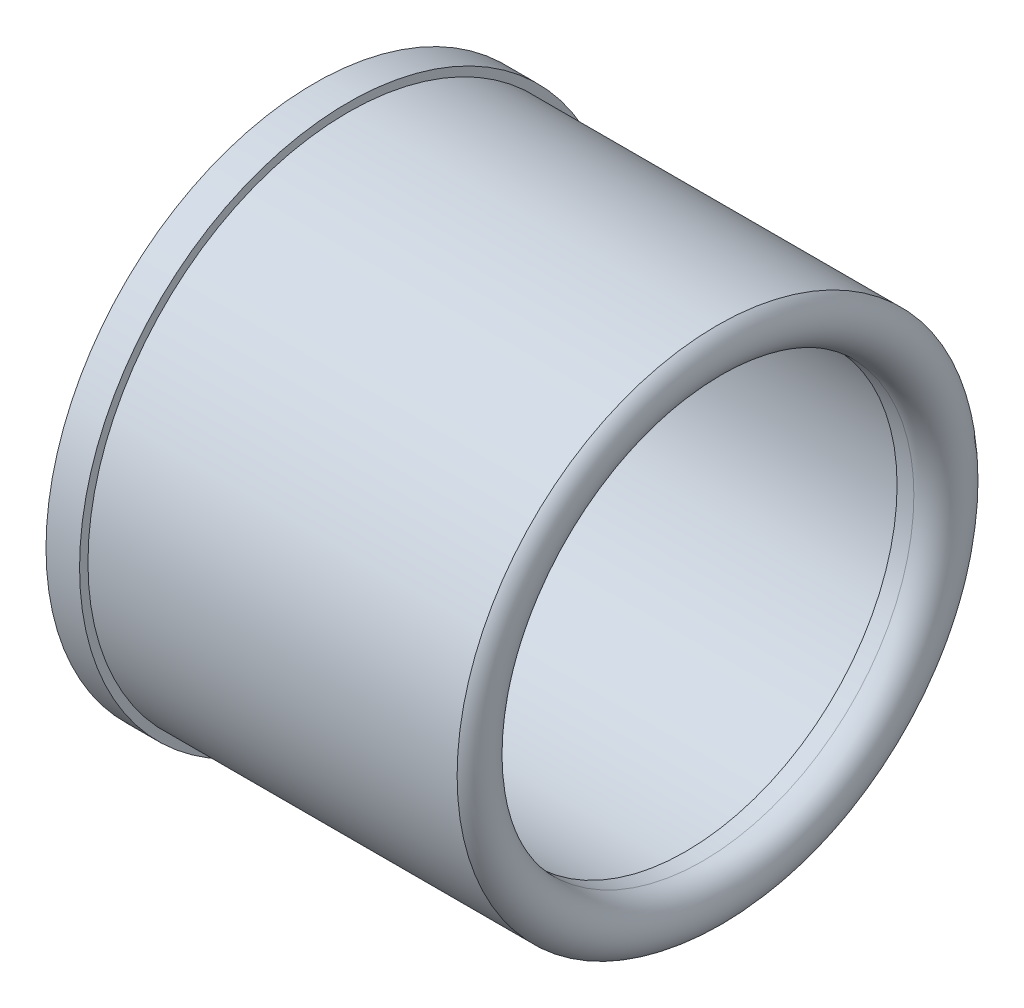
ISO-10303-21;
HEADER;
FILE_DESCRIPTION(('STEP AP214'),'2;1');
FILE_NAME('part.step','',(''),(''),'','','');
FILE_SCHEMA(('AUTOMOTIVE_DESIGN { 1 0 10303 214 1 1 1 1 }'));
ENDSEC;
DATA;
#1=APPLICATION_CONTEXT('core data for automotive mechanical design processes');
#2=APPLICATION_PROTOCOL_DEFINITION('international standard','automotive_design',2000,#1);
#3=PRODUCT_CONTEXT('',#1,'mechanical');
#4=PRODUCT('Part','Part','',(#3));
#5=PRODUCT_RELATED_PRODUCT_CATEGORY('part','',(#4));
#6=PRODUCT_DEFINITION_FORMATION('','',#4);
#7=PRODUCT_DEFINITION_CONTEXT('part definition',#1,'design');
#8=PRODUCT_DEFINITION('design','',#6,#7);
#9=PRODUCT_DEFINITION_SHAPE('','',#8);
#10=(LENGTH_UNIT() NAMED_UNIT(*) SI_UNIT(.MILLI.,.METRE.));
#11=(NAMED_UNIT(*) PLANE_ANGLE_UNIT() SI_UNIT($,.RADIAN.));
#12=(NAMED_UNIT(*) SI_UNIT($,.STERADIAN.) SOLID_ANGLE_UNIT());
#13=UNCERTAINTY_MEASURE_WITH_UNIT(LENGTH_MEASURE(1.E-05),#10,'distance_accuracy_value','');
#14=(GEOMETRIC_REPRESENTATION_CONTEXT(3) GLOBAL_UNCERTAINTY_ASSIGNED_CONTEXT((#13)) GLOBAL_UNIT_ASSIGNED_CONTEXT((#10,
#11,#12)) REPRESENTATION_CONTEXT('',''));
#15=CARTESIAN_POINT('',(0.,0.,0.));
#16=DIRECTION('',(0.,0.,1.));
#17=DIRECTION('',(1.,0.,0.));
#18=AXIS2_PLACEMENT_3D('',#15,#16,#17);
#19=CARTESIAN_POINT('',(12.1757416936097,-8.53326323507829,0.));
#20=DIRECTION('',(-1.,0.,0.));
#21=DIRECTION('',(0.,0.,1.));
#22=AXIS2_PLACEMENT_3D('',#19,#20,#21);
#23=CYLINDRICAL_SURFACE('',#22,6.3);
#24=CARTESIAN_POINT('',(11.9728126653829,-8.53326323507829,0.));
#25=DIRECTION('',(-1.,0.,0.));
#26=DIRECTION('',(0.,0.,1.));
#27=AXIS2_PLACEMENT_3D('',#24,#25,#26);
#28=CIRCLE('',#27,6.3);
#29=CARTESIAN_POINT('',(11.9728126653829,-8.53326323507829,6.3));
#30=VERTEX_POINT('',#29);
#31=EDGE_CURVE('E10',#30,#30,#28,.T.);
#32=ORIENTED_EDGE('',*,*,#31,.T.);
#33=EDGE_LOOP('',(#32));
#34=FACE_BOUND('',#33,.T.);
#35=CARTESIAN_POINT('',(12.4728126653829,-8.53326323507829,0.));
#36=DIRECTION('',(-1.,0.,0.));
#37=DIRECTION('',(0.,0.,1.));
#38=AXIS2_PLACEMENT_3D('',#35,#36,#37);
#39=CIRCLE('',#38,6.3);
#40=CARTESIAN_POINT('',(12.4728126653829,-8.53326323507829,6.3));
#41=VERTEX_POINT('',#40);
#42=EDGE_CURVE('E61',#41,#41,#39,.T.);
#43=ORIENTED_EDGE('',*,*,#42,.F.);
#44=EDGE_LOOP('',(#43));
#45=FACE_BOUND('',#44,.T.);
#46=ADVANCED_FACE('F33',(#34,#45),#23,.F.);
#47=CARTESIAN_POINT('',(11.9728126653829,-2.23326323507829,0.));
#48=DIRECTION('',(-1.,0.,0.));
#49=DIRECTION('',(0.,0.,1.));
#50=AXIS2_PLACEMENT_3D('',#47,#48,#49);
#51=PLANE('',#50);
#52=CARTESIAN_POINT('',(11.9728126653829,-8.53326323507829,0.));
#53=DIRECTION('',(-1.,0.,0.));
#54=DIRECTION('',(0.,0.,1.));
#55=AXIS2_PLACEMENT_3D('',#52,#53,#54);
#56=CIRCLE('',#55,6.55);
#57=CARTESIAN_POINT('',(11.9728126653829,-8.53326323507829,6.55));
#58=VERTEX_POINT('',#57);
#59=EDGE_CURVE('E39',#58,#58,#56,.T.);
#60=ORIENTED_EDGE('',*,*,#59,.T.);
#61=EDGE_LOOP('',(#60));
#62=FACE_BOUND('',#61,.T.);
#63=ORIENTED_EDGE('',*,*,#31,.F.);
#64=EDGE_LOOP('',(#63));
#65=FACE_BOUND('',#64,.T.);
#66=ADVANCED_FACE('F69',(#62,#65),#51,.T.);
#67=CARTESIAN_POINT('',(12.1757416936097,-8.53326323507829,0.));
#68=DIRECTION('',(-1.,0.,0.));
#69=DIRECTION('',(0.,0.,1.));
#70=AXIS2_PLACEMENT_3D('',#67,#68,#69);
#71=CYLINDRICAL_SURFACE('',#70,6.55);
#72=CARTESIAN_POINT('',(0.912123334161097,-8.53326323507829,0.));
#73=DIRECTION('',(-1.,0.,0.));
#74=DIRECTION('',(0.,0.,1.));
#75=AXIS2_PLACEMENT_3D('',#72,#73,#74);
#76=CIRCLE('',#75,6.55);
#77=CARTESIAN_POINT('',(0.912123334161097,-8.53326323507829,6.55));
#78=VERTEX_POINT('',#77);
#79=EDGE_CURVE('E43',#78,#78,#76,.T.);
#80=ORIENTED_EDGE('',*,*,#79,.T.);
#81=EDGE_LOOP('',(#80));
#82=FACE_BOUND('',#81,.T.);
#83=ORIENTED_EDGE('',*,*,#59,.F.);
#84=EDGE_LOOP('',(#83));
#85=FACE_BOUND('',#84,.T.);
#86=ADVANCED_FACE('F73',(#82,#85),#71,.F.);
#87=CARTESIAN_POINT('',(0.912123334161096,-1.98326323507829,0.));
#88=DIRECTION('',(-1.,0.,0.));
#89=DIRECTION('',(0.,0.,1.));
#90=AXIS2_PLACEMENT_3D('',#87,#88,#89);
#91=PLANE('',#90);
#92=CARTESIAN_POINT('',(0.912123334161097,-8.53326323507829,0.));
#93=DIRECTION('',(-1.,0.,0.));
#94=DIRECTION('',(0.,0.,1.));
#95=AXIS2_PLACEMENT_3D('',#92,#93,#94);
#96=CIRCLE('',#95,8.);
#97=CARTESIAN_POINT('',(0.912123334161097,-8.53326323507829,8.));
#98=VERTEX_POINT('',#97);
#99=EDGE_CURVE('E47',#98,#98,#96,.T.);
#100=ORIENTED_EDGE('',*,*,#99,.T.);
#101=EDGE_LOOP('',(#100));
#102=FACE_BOUND('',#101,.T.);
#103=ORIENTED_EDGE('',*,*,#79,.F.);
#104=EDGE_LOOP('',(#103));
#105=FACE_BOUND('',#104,.T.);
#106=ADVANCED_FACE('F77',(#102,#105),#91,.T.);
#107=CARTESIAN_POINT('',(12.1757416936097,-8.53326323507829,0.));
#108=DIRECTION('',(-1.,0.,0.));
#109=DIRECTION('',(0.,0.,1.));
#110=AXIS2_PLACEMENT_3D('',#107,#108,#109);
#111=CYLINDRICAL_SURFACE('',#110,8.);
#112=CARTESIAN_POINT('',(1.9121233341611,-8.53326323507829,0.));
#113=DIRECTION('',(-1.,0.,0.));
#114=DIRECTION('',(0.,0.,1.));
#115=AXIS2_PLACEMENT_3D('',#112,#113,#114);
#116=CIRCLE('',#115,8.);
#117=CARTESIAN_POINT('',(1.9121233341611,-8.53326323507829,8.));
#118=VERTEX_POINT('',#117);
#119=EDGE_CURVE('E52',#118,#118,#116,.T.);
#120=ORIENTED_EDGE('',*,*,#119,.T.);
#121=EDGE_LOOP('',(#120));
#122=FACE_BOUND('',#121,.T.);
#123=ORIENTED_EDGE('',*,*,#99,.F.);
#124=EDGE_LOOP('',(#123));
#125=FACE_BOUND('',#124,.T.);
#126=ADVANCED_FACE('F84',(#122,#125),#111,.T.);
#127=CARTESIAN_POINT('',(1.9121233341611,-0.533263235078294,0.));
#128=DIRECTION('',(1.,0.,0.));
#129=DIRECTION('',(0.,0.,-1.));
#130=AXIS2_PLACEMENT_3D('',#127,#128,#129);
#131=PLANE('',#130);
#132=CARTESIAN_POINT('',(1.9121233341611,-8.53326323507829,0.));
#133=DIRECTION('',(-1.,0.,0.));
#134=DIRECTION('',(0.,0.,1.));
#135=AXIS2_PLACEMENT_3D('',#132,#133,#134);
#136=CIRCLE('',#135,7.75);
#137=CARTESIAN_POINT('',(1.9121233341611,-8.53326323507829,7.75));
#138=VERTEX_POINT('',#137);
#139=EDGE_CURVE('E55',#138,#138,#136,.T.);
#140=ORIENTED_EDGE('',*,*,#139,.T.);
#141=EDGE_LOOP('',(#140));
#142=FACE_BOUND('',#141,.T.);
#143=ORIENTED_EDGE('',*,*,#119,.F.);
#144=EDGE_LOOP('',(#143));
#145=FACE_BOUND('',#144,.T.);
#146=ADVANCED_FACE('F88',(#142,#145),#131,.T.);
#147=CARTESIAN_POINT('',(12.1757416936097,-8.53326323507829,0.));
#148=DIRECTION('',(-1.,0.,0.));
#149=DIRECTION('',(0.,0.,1.));
#150=AXIS2_PLACEMENT_3D('',#147,#148,#149);
#151=CYLINDRICAL_SURFACE('',#150,7.75);
#152=CARTESIAN_POINT('',(12.9121233341611,-8.53326323507829,0.));
#153=DIRECTION('',(-1.,0.,0.));
#154=DIRECTION('',(0.,0.,1.));
#155=AXIS2_PLACEMENT_3D('',#152,#153,#154);
#156=CIRCLE('',#155,7.75);
#157=CARTESIAN_POINT('',(12.9121233341611,-8.53326323507829,7.75));
#158=VERTEX_POINT('',#157);
#159=EDGE_CURVE('E58',#158,#158,#156,.T.);
#160=ORIENTED_EDGE('',*,*,#159,.T.);
#161=EDGE_LOOP('',(#160));
#162=FACE_BOUND('',#161,.T.);
#163=ORIENTED_EDGE('',*,*,#139,.F.);
#164=EDGE_LOOP('',(#163));
#165=FACE_BOUND('',#164,.T.);
#166=ADVANCED_FACE('F92',(#162,#165),#151,.T.);
#167=CARTESIAN_POINT('',(12.4728126653829,-8.53326323507829,0.));
#168=DIRECTION('',(-1.,0.,0.));
#169=DIRECTION('',(0.,0.,1.));
#170=AXIS2_PLACEMENT_3D('',#167,#168,#169);
#171=TOROIDAL_SURFACE('',#170,7.09154960817322,0.791549608173223);
#172=ORIENTED_EDGE('',*,*,#42,.T.);
#173=EDGE_LOOP('',(#172));
#174=FACE_BOUND('',#173,.T.);
#175=ORIENTED_EDGE('',*,*,#159,.F.);
#176=EDGE_LOOP('',(#175));
#177=FACE_BOUND('',#176,.T.);
#178=ADVANCED_FACE('F65',(#174,#177),#171,.T.);
#179=CLOSED_SHELL('',(#46,#66,#86,#106,#126,#146,#166,#178));
#180=MANIFOLD_SOLID_BREP('B2',#179);
#181=ADVANCED_BREP_SHAPE_REPRESENTATION('',(#18,#180),#14);
#182=SHAPE_DEFINITION_REPRESENTATION(#9,#181);
ENDSEC;
END-ISO-10303-21;
